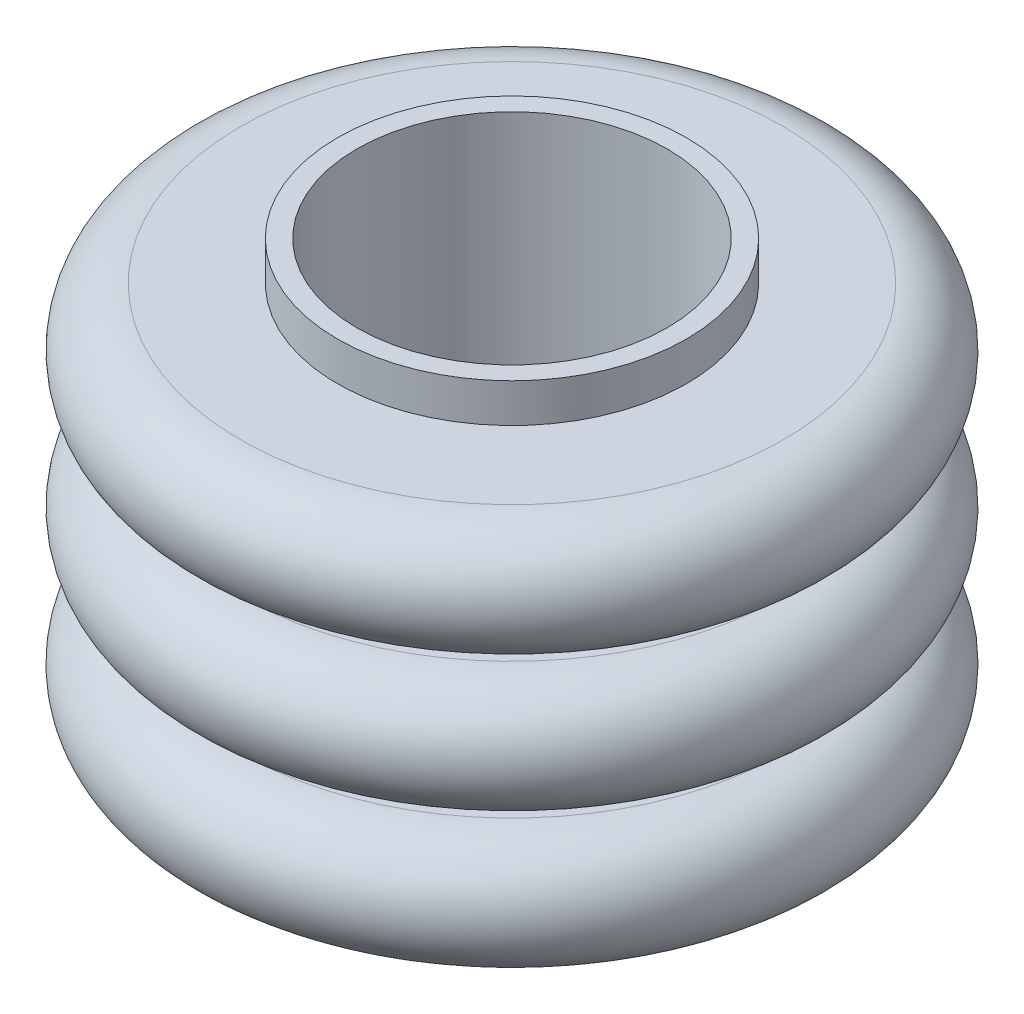
ISO-10303-21;
HEADER;
FILE_DESCRIPTION(('STEP AP214'),'2;1');
FILE_NAME('part.step','',(''),(''),'','','');
FILE_SCHEMA(('AUTOMOTIVE_DESIGN { 1 0 10303 214 1 1 1 1 }'));
ENDSEC;
DATA;
#1=APPLICATION_CONTEXT('core data for automotive mechanical design processes');
#2=APPLICATION_PROTOCOL_DEFINITION('international standard','automotive_design',2000,#1);
#3=PRODUCT_CONTEXT('',#1,'mechanical');
#4=PRODUCT('Part','Part','',(#3));
#5=PRODUCT_RELATED_PRODUCT_CATEGORY('part','',(#4));
#6=PRODUCT_DEFINITION_FORMATION('','',#4);
#7=PRODUCT_DEFINITION_CONTEXT('part definition',#1,'design');
#8=PRODUCT_DEFINITION('design','',#6,#7);
#9=PRODUCT_DEFINITION_SHAPE('','',#8);
#10=(LENGTH_UNIT() NAMED_UNIT(*) SI_UNIT(.MILLI.,.METRE.));
#11=(NAMED_UNIT(*) PLANE_ANGLE_UNIT() SI_UNIT($,.RADIAN.));
#12=(NAMED_UNIT(*) SI_UNIT($,.STERADIAN.) SOLID_ANGLE_UNIT());
#13=UNCERTAINTY_MEASURE_WITH_UNIT(LENGTH_MEASURE(1.E-05),#10,'distance_accuracy_value','');
#14=(GEOMETRIC_REPRESENTATION_CONTEXT(3) GLOBAL_UNCERTAINTY_ASSIGNED_CONTEXT((#13)) GLOBAL_UNIT_ASSIGNED_CONTEXT((#10,
#11,#12)) REPRESENTATION_CONTEXT('',''));
#15=CARTESIAN_POINT('',(0.,0.,0.));
#16=DIRECTION('',(0.,0.,1.));
#17=DIRECTION('',(1.,0.,0.));
#18=AXIS2_PLACEMENT_3D('',#15,#16,#17);
#19=CARTESIAN_POINT('',(0.,10.795,0.));
#20=DIRECTION('',(0.,-1.,0.));
#21=DIRECTION('',(0.,0.,-1.));
#22=AXIS2_PLACEMENT_3D('',#19,#20,#21);
#23=TOROIDAL_SURFACE('',#22,8.89,1.905);
#24=CARTESIAN_POINT('',(0.,8.89,0.));
#25=DIRECTION('',(0.,-1.,0.));
#26=DIRECTION('',(0.,0.,-1.));
#27=AXIS2_PLACEMENT_3D('',#24,#25,#26);
#28=CIRCLE('',#27,8.89);
#29=CARTESIAN_POINT('',(0.,8.89,-8.89));
#30=VERTEX_POINT('',#29);
#31=EDGE_CURVE('E39',#30,#30,#28,.T.);
#32=ORIENTED_EDGE('',*,*,#31,.F.);
#33=EDGE_LOOP('',(#32));
#34=FACE_BOUND('',#33,.T.);
#35=CARTESIAN_POINT('',(0.,12.7,0.));
#36=DIRECTION('',(0.,-1.,0.));
#37=DIRECTION('',(0.,0.,-1.));
#38=AXIS2_PLACEMENT_3D('',#35,#36,#37);
#39=CIRCLE('',#38,8.89);
#40=CARTESIAN_POINT('',(0.,12.7,-8.89));
#41=VERTEX_POINT('',#40);
#42=EDGE_CURVE('E10',#41,#41,#39,.F.);
#43=ORIENTED_EDGE('',*,*,#42,.F.);
#44=EDGE_LOOP('',(#43));
#45=FACE_BOUND('',#44,.T.);
#46=ADVANCED_FACE('F32',(#34,#45),#23,.T.);
#47=CARTESIAN_POINT('',(0.,6.35,0.));
#48=DIRECTION('',(0.,-1.,0.));
#49=DIRECTION('',(0.,0.,-1.));
#50=AXIS2_PLACEMENT_3D('',#47,#48,#49);
#51=TOROIDAL_SURFACE('',#50,8.89,1.905);
#52=CARTESIAN_POINT('',(0.,4.445,0.));
#53=DIRECTION('',(0.,-1.,0.));
#54=DIRECTION('',(0.,0.,-1.));
#55=AXIS2_PLACEMENT_3D('',#52,#53,#54);
#56=CIRCLE('',#55,8.89);
#57=CARTESIAN_POINT('',(0.,4.445,-8.89));
#58=VERTEX_POINT('',#57);
#59=EDGE_CURVE('E47',#58,#58,#56,.T.);
#60=ORIENTED_EDGE('',*,*,#59,.F.);
#61=EDGE_LOOP('',(#60));
#62=FACE_BOUND('',#61,.T.);
#63=CARTESIAN_POINT('',(0.,8.255,0.));
#64=DIRECTION('',(0.,-1.,0.));
#65=DIRECTION('',(0.,0.,-1.));
#66=AXIS2_PLACEMENT_3D('',#63,#64,#65);
#67=CIRCLE('',#66,8.89);
#68=CARTESIAN_POINT('',(0.,8.255,-8.89));
#69=VERTEX_POINT('',#68);
#70=EDGE_CURVE('E43',#69,#69,#67,.F.);
#71=ORIENTED_EDGE('',*,*,#70,.F.);
#72=EDGE_LOOP('',(#71));
#73=FACE_BOUND('',#72,.T.);
#74=ADVANCED_FACE('F97',(#62,#73),#51,.T.);
#75=CARTESIAN_POINT('',(0.,1.905,0.));
#76=DIRECTION('',(0.,-1.,0.));
#77=DIRECTION('',(0.,0.,-1.));
#78=AXIS2_PLACEMENT_3D('',#75,#76,#77);
#79=TOROIDAL_SURFACE('',#78,8.89,1.905);
#80=CARTESIAN_POINT('',(0.,0.,0.));
#81=DIRECTION('',(0.,1.,0.));
#82=DIRECTION('',(0.,0.,1.));
#83=AXIS2_PLACEMENT_3D('',#80,#81,#82);
#84=CIRCLE('',#83,8.89);
#85=CARTESIAN_POINT('',(0.,0.,8.89));
#86=VERTEX_POINT('',#85);
#87=EDGE_CURVE('E55',#86,#86,#84,.F.);
#88=ORIENTED_EDGE('',*,*,#87,.F.);
#89=EDGE_LOOP('',(#88));
#90=FACE_BOUND('',#89,.T.);
#91=CARTESIAN_POINT('',(0.,3.81,0.));
#92=DIRECTION('',(0.,-1.,0.));
#93=DIRECTION('',(0.,0.,-1.));
#94=AXIS2_PLACEMENT_3D('',#91,#92,#93);
#95=CIRCLE('',#94,8.89);
#96=CARTESIAN_POINT('',(0.,3.81,-8.89));
#97=VERTEX_POINT('',#96);
#98=EDGE_CURVE('E52',#97,#97,#95,.F.);
#99=ORIENTED_EDGE('',*,*,#98,.F.);
#100=EDGE_LOOP('',(#99));
#101=FACE_BOUND('',#100,.T.);
#102=ADVANCED_FACE('F102',(#90,#101),#79,.T.);
#103=CARTESIAN_POINT('',(0.,13.97,0.));
#104=DIRECTION('',(0.,-1.,0.));
#105=DIRECTION('',(0.,0.,-1.));
#106=AXIS2_PLACEMENT_3D('',#103,#104,#105);
#107=CYLINDRICAL_SURFACE('',#106,5.715);
#108=CARTESIAN_POINT('',(0.,13.97,0.));
#109=DIRECTION('',(0.,1.,0.));
#110=DIRECTION('',(0.,0.,1.));
#111=AXIS2_PLACEMENT_3D('',#108,#109,#110);
#112=CIRCLE('',#111,5.715);
#113=CARTESIAN_POINT('',(0.,13.97,5.715));
#114=VERTEX_POINT('',#113);
#115=EDGE_CURVE('E67',#114,#114,#112,.T.);
#116=ORIENTED_EDGE('',*,*,#115,.F.);
#117=EDGE_LOOP('',(#116));
#118=FACE_BOUND('',#117,.T.);
#119=CARTESIAN_POINT('',(0.,12.7,0.));
#120=DIRECTION('',(0.,-1.,0.));
#121=DIRECTION('',(0.,0.,-1.));
#122=AXIS2_PLACEMENT_3D('',#119,#120,#121);
#123=CIRCLE('',#122,5.715);
#124=CARTESIAN_POINT('',(0.,12.7,-5.715));
#125=VERTEX_POINT('',#124);
#126=EDGE_CURVE('E58',#125,#125,#123,.T.);
#127=ORIENTED_EDGE('',*,*,#126,.F.);
#128=EDGE_LOOP('',(#127));
#129=FACE_BOUND('',#128,.T.);
#130=ADVANCED_FACE('F108',(#118,#129),#107,.T.);
#131=CARTESIAN_POINT('',(0.,8.89,0.));
#132=DIRECTION('',(0.,-1.,0.));
#133=DIRECTION('',(0.,0.,-1.));
#134=AXIS2_PLACEMENT_3D('',#131,#132,#133);
#135=CIRCLE('',#134,5.715);
#136=CARTESIAN_POINT('',(0.,8.89,-5.715));
#137=VERTEX_POINT('',#136);
#138=EDGE_CURVE('E79',#137,#137,#135,.T.);
#139=ORIENTED_EDGE('',*,*,#138,.T.);
#140=EDGE_LOOP('',(#139));
#141=FACE_BOUND('',#140,.T.);
#142=CARTESIAN_POINT('',(0.,8.255,0.));
#143=DIRECTION('',(0.,-1.,0.));
#144=DIRECTION('',(0.,0.,-1.));
#145=AXIS2_PLACEMENT_3D('',#142,#143,#144);
#146=CIRCLE('',#145,5.715);
#147=CARTESIAN_POINT('',(0.,8.255,-5.715));
#148=VERTEX_POINT('',#147);
#149=EDGE_CURVE('E61',#148,#148,#146,.T.);
#150=ORIENTED_EDGE('',*,*,#149,.F.);
#151=EDGE_LOOP('',(#150));
#152=FACE_BOUND('',#151,.T.);
#153=ADVANCED_FACE('F83',(#141,#152),#107,.T.);
#154=CARTESIAN_POINT('',(0.,4.445,0.));
#155=DIRECTION('',(0.,-1.,0.));
#156=DIRECTION('',(0.,0.,-1.));
#157=AXIS2_PLACEMENT_3D('',#154,#155,#156);
#158=CIRCLE('',#157,5.715);
#159=CARTESIAN_POINT('',(0.,4.445,-5.715));
#160=VERTEX_POINT('',#159);
#161=EDGE_CURVE('E74',#160,#160,#158,.T.);
#162=ORIENTED_EDGE('',*,*,#161,.T.);
#163=EDGE_LOOP('',(#162));
#164=FACE_BOUND('',#163,.T.);
#165=CARTESIAN_POINT('',(0.,3.81,0.));
#166=DIRECTION('',(0.,-1.,0.));
#167=DIRECTION('',(0.,0.,-1.));
#168=AXIS2_PLACEMENT_3D('',#165,#166,#167);
#169=CIRCLE('',#168,5.715);
#170=CARTESIAN_POINT('',(0.,3.81,-5.715));
#171=VERTEX_POINT('',#170);
#172=EDGE_CURVE('E64',#171,#171,#169,.T.);
#173=ORIENTED_EDGE('',*,*,#172,.F.);
#174=EDGE_LOOP('',(#173));
#175=FACE_BOUND('',#174,.T.);
#176=ADVANCED_FACE('F120',(#164,#175),#107,.T.);
#177=CARTESIAN_POINT('',(0.,13.97,0.));
#178=DIRECTION('',(0.,1.,0.));
#179=DIRECTION('',(0.,0.,1.));
#180=AXIS2_PLACEMENT_3D('',#177,#178,#179);
#181=PLANE('',#180);
#182=ORIENTED_EDGE('',*,*,#115,.T.);
#183=EDGE_LOOP('',(#182));
#184=FACE_BOUND('',#183,.T.);
#185=CARTESIAN_POINT('',(0.,13.97,0.));
#186=DIRECTION('',(0.,1.,0.));
#187=DIRECTION('',(0.,0.,1.));
#188=AXIS2_PLACEMENT_3D('',#185,#186,#187);
#189=CIRCLE('',#188,5.08);
#190=CARTESIAN_POINT('',(0.,13.97,5.08));
#191=VERTEX_POINT('',#190);
#192=EDGE_CURVE('E70',#191,#191,#189,.T.);
#193=ORIENTED_EDGE('',*,*,#192,.F.);
#194=EDGE_LOOP('',(#193));
#195=FACE_BOUND('',#194,.T.);
#196=ADVANCED_FACE('F123',(#184,#195),#181,.T.);
#197=CARTESIAN_POINT('',(0.,0.,0.));
#198=DIRECTION('',(0.,1.,0.));
#199=DIRECTION('',(0.,0.,1.));
#200=AXIS2_PLACEMENT_3D('',#197,#198,#199);
#201=PLANE('',#200);
#202=ORIENTED_EDGE('',*,*,#87,.T.);
#203=EDGE_LOOP('',(#202));
#204=FACE_BOUND('',#203,.T.);
#205=CARTESIAN_POINT('',(0.,0.,0.));
#206=DIRECTION('',(0.,1.,0.));
#207=DIRECTION('',(0.,0.,1.));
#208=AXIS2_PLACEMENT_3D('',#205,#206,#207);
#209=CIRCLE('',#208,5.08);
#210=CARTESIAN_POINT('',(0.,0.,5.08));
#211=VERTEX_POINT('',#210);
#212=EDGE_CURVE('E71',#211,#211,#209,.T.);
#213=ORIENTED_EDGE('',*,*,#212,.T.);
#214=EDGE_LOOP('',(#213));
#215=FACE_BOUND('',#214,.T.);
#216=ADVANCED_FACE('F125',(#204,#215),#201,.F.);
#217=CARTESIAN_POINT('',(0.,13.97,0.));
#218=DIRECTION('',(0.,-1.,0.));
#219=DIRECTION('',(0.,0.,-1.));
#220=AXIS2_PLACEMENT_3D('',#217,#218,#219);
#221=CYLINDRICAL_SURFACE('',#220,5.08);
#222=ORIENTED_EDGE('',*,*,#192,.T.);
#223=EDGE_LOOP('',(#222));
#224=FACE_BOUND('',#223,.T.);
#225=ORIENTED_EDGE('',*,*,#212,.F.);
#226=EDGE_LOOP('',(#225));
#227=FACE_BOUND('',#226,.T.);
#228=ADVANCED_FACE('F128',(#224,#227),#221,.F.);
#229=CARTESIAN_POINT('',(0.,3.81,0.));
#230=DIRECTION('',(0.,-1.,0.));
#231=DIRECTION('',(0.,0.,-1.));
#232=AXIS2_PLACEMENT_3D('',#229,#230,#231);
#233=PLANE('',#232);
#234=ORIENTED_EDGE('',*,*,#98,.T.);
#235=EDGE_LOOP('',(#234));
#236=FACE_BOUND('',#235,.T.);
#237=ORIENTED_EDGE('',*,*,#172,.T.);
#238=EDGE_LOOP('',(#237));
#239=FACE_BOUND('',#238,.T.);
#240=ADVANCED_FACE('F135',(#236,#239),#233,.F.);
#241=CARTESIAN_POINT('',(0.,8.255,0.));
#242=DIRECTION('',(0.,-1.,0.));
#243=DIRECTION('',(0.,0.,-1.));
#244=AXIS2_PLACEMENT_3D('',#241,#242,#243);
#245=PLANE('',#244);
#246=ORIENTED_EDGE('',*,*,#70,.T.);
#247=EDGE_LOOP('',(#246));
#248=FACE_BOUND('',#247,.T.);
#249=ORIENTED_EDGE('',*,*,#149,.T.);
#250=EDGE_LOOP('',(#249));
#251=FACE_BOUND('',#250,.T.);
#252=ADVANCED_FACE('F139',(#248,#251),#245,.F.);
#253=CARTESIAN_POINT('',(0.,4.445,0.));
#254=DIRECTION('',(0.,-1.,0.));
#255=DIRECTION('',(0.,0.,-1.));
#256=AXIS2_PLACEMENT_3D('',#253,#254,#255);
#257=PLANE('',#256);
#258=ORIENTED_EDGE('',*,*,#59,.T.);
#259=EDGE_LOOP('',(#258));
#260=FACE_BOUND('',#259,.T.);
#261=ORIENTED_EDGE('',*,*,#161,.F.);
#262=EDGE_LOOP('',(#261));
#263=FACE_BOUND('',#262,.T.);
#264=ADVANCED_FACE('F93',(#260,#263),#257,.T.);
#265=CARTESIAN_POINT('',(0.,12.7,0.));
#266=DIRECTION('',(0.,-1.,0.));
#267=DIRECTION('',(0.,0.,-1.));
#268=AXIS2_PLACEMENT_3D('',#265,#266,#267);
#269=PLANE('',#268);
#270=ORIENTED_EDGE('',*,*,#42,.T.);
#271=EDGE_LOOP('',(#270));
#272=FACE_BOUND('',#271,.T.);
#273=ORIENTED_EDGE('',*,*,#126,.T.);
#274=EDGE_LOOP('',(#273));
#275=FACE_BOUND('',#274,.T.);
#276=ADVANCED_FACE('F88',(#272,#275),#269,.F.);
#277=CARTESIAN_POINT('',(0.,8.89,0.));
#278=DIRECTION('',(0.,-1.,0.));
#279=DIRECTION('',(0.,0.,-1.));
#280=AXIS2_PLACEMENT_3D('',#277,#278,#279);
#281=PLANE('',#280);
#282=ORIENTED_EDGE('',*,*,#31,.T.);
#283=EDGE_LOOP('',(#282));
#284=FACE_BOUND('',#283,.T.);
#285=ORIENTED_EDGE('',*,*,#138,.F.);
#286=EDGE_LOOP('',(#285));
#287=FACE_BOUND('',#286,.T.);
#288=ADVANCED_FACE('F86',(#284,#287),#281,.T.);
#289=CLOSED_SHELL('',(#46,#74,#102,#130,#153,#176,#196,#216,#228,#240,#252,#264,#276,#288));
#290=MANIFOLD_SOLID_BREP('B2',#289);
#291=ADVANCED_BREP_SHAPE_REPRESENTATION('',(#18,#290),#14);
#292=SHAPE_DEFINITION_REPRESENTATION(#9,#291);
ENDSEC;
END-ISO-10303-21;
